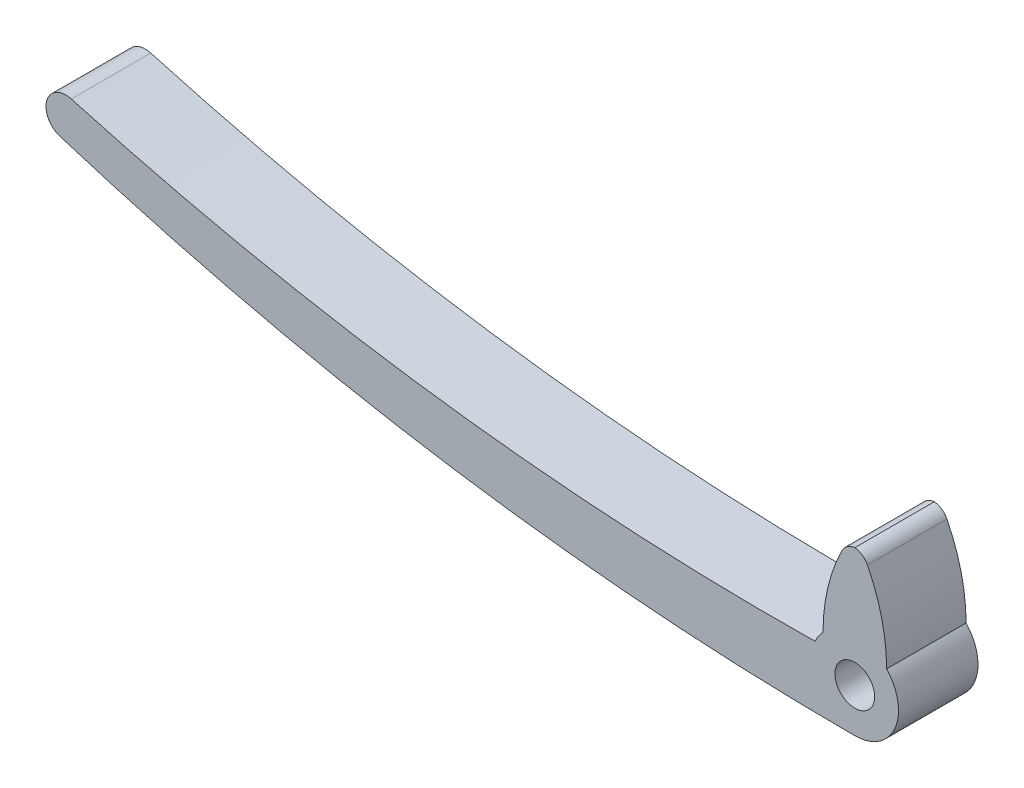
ISO-10303-21;
HEADER;
FILE_DESCRIPTION(('STEP AP214'),'2;1');
FILE_NAME('part.step','',(''),(''),'','','');
FILE_SCHEMA(('AUTOMOTIVE_DESIGN { 1 0 10303 214 1 1 1 1 }'));
ENDSEC;
DATA;
#1=APPLICATION_CONTEXT('core data for automotive mechanical design processes');
#2=APPLICATION_PROTOCOL_DEFINITION('international standard','automotive_design',2000,#1);
#3=PRODUCT_CONTEXT('',#1,'mechanical');
#4=PRODUCT('Part','Part','',(#3));
#5=PRODUCT_RELATED_PRODUCT_CATEGORY('part','',(#4));
#6=PRODUCT_DEFINITION_FORMATION('','',#4);
#7=PRODUCT_DEFINITION_CONTEXT('part definition',#1,'design');
#8=PRODUCT_DEFINITION('design','',#6,#7);
#9=PRODUCT_DEFINITION_SHAPE('','',#8);
#10=(LENGTH_UNIT() NAMED_UNIT(*) SI_UNIT(.MILLI.,.METRE.));
#11=(NAMED_UNIT(*) PLANE_ANGLE_UNIT() SI_UNIT($,.RADIAN.));
#12=(NAMED_UNIT(*) SI_UNIT($,.STERADIAN.) SOLID_ANGLE_UNIT());
#13=UNCERTAINTY_MEASURE_WITH_UNIT(LENGTH_MEASURE(1.E-05),#10,'distance_accuracy_value','');
#14=(GEOMETRIC_REPRESENTATION_CONTEXT(3) GLOBAL_UNCERTAINTY_ASSIGNED_CONTEXT((#13)) GLOBAL_UNIT_ASSIGNED_CONTEXT((#10,
#11,#12)) REPRESENTATION_CONTEXT('',''));
#15=CARTESIAN_POINT('',(0.,0.,0.));
#16=DIRECTION('',(0.,0.,1.));
#17=DIRECTION('',(1.,0.,0.));
#18=AXIS2_PLACEMENT_3D('',#15,#16,#17);
#19=CARTESIAN_POINT('',(-99.2546151641321,12.1869343405152,5.));
#20=DIRECTION('',(0.,0.,1.));
#21=DIRECTION('',(1.,0.,0.));
#22=AXIS2_PLACEMENT_3D('',#19,#20,#21);
#23=PLANE('',#22);
#24=CARTESIAN_POINT('',(-18.5004139118231,3.77491721763537,5.));
#25=DIRECTION('',(0.,0.,1.));
#26=DIRECTION('',(1.,0.,0.));
#27=AXIS2_PLACEMENT_3D('',#24,#25,#26);
#28=CIRCLE('',#27,22.5004139118231);
#29=CARTESIAN_POINT('',(4.,3.77491721763538,5.));
#30=VERTEX_POINT('',#29);
#31=CARTESIAN_POINT('',(1.59315543966662,13.8999899047935,5.));
#32=VERTEX_POINT('',#31);
#33=EDGE_CURVE('E159',#30,#32,#28,.T.);
#34=ORIENTED_EDGE('',*,*,#33,.T.);
#35=CARTESIAN_POINT('',(-0.192906757254242,13.,5.));
#36=DIRECTION('',(0.,0.,1.));
#37=DIRECTION('',(1.,0.,0.));
#38=AXIS2_PLACEMENT_3D('',#35,#36,#37);
#39=CIRCLE('',#38,2.);
#40=CARTESIAN_POINT('',(0.,14.9906750068772,5.));
#41=VERTEX_POINT('',#40);
#42=EDGE_CURVE('E48',#32,#41,#39,.T.);
#43=ORIENTED_EDGE('',*,*,#42,.T.);
#44=CARTESIAN_POINT('',(0.192906757254242,13.,5.));
#45=DIRECTION('',(0.,0.,1.));
#46=DIRECTION('',(1.,0.,0.));
#47=AXIS2_PLACEMENT_3D('',#44,#45,#46);
#48=CIRCLE('',#47,2.);
#49=CARTESIAN_POINT('',(-1.59315543966662,13.8999899047935,5.));
#50=VERTEX_POINT('',#49);
#51=EDGE_CURVE('E58',#41,#50,#48,.T.);
#52=ORIENTED_EDGE('',*,*,#51,.T.);
#53=CARTESIAN_POINT('',(18.5004139118231,3.77491721763537,5.));
#54=DIRECTION('',(0.,0.,1.));
#55=DIRECTION('',(1.,0.,0.));
#56=AXIS2_PLACEMENT_3D('',#53,#54,#55);
#57=CIRCLE('',#56,22.5004139118231);
#58=CARTESIAN_POINT('',(-4.,3.77491721763538,5.));
#59=VERTEX_POINT('',#58);
#60=EDGE_CURVE('E166',#50,#59,#57,.T.);
#61=ORIENTED_EDGE('',*,*,#60,.T.);
#62=CARTESIAN_POINT('',(0.,0.,5.));
#63=DIRECTION('',(0.,0.,1.));
#64=DIRECTION('',(1.,0.,0.));
#65=AXIS2_PLACEMENT_3D('',#62,#63,#64);
#66=CIRCLE('',#65,5.50000000000001);
#67=CARTESIAN_POINT('',(-5.00000000000002,2.29128784747789,5.));
#68=VERTEX_POINT('',#67);
#69=EDGE_CURVE('E170',#59,#68,#66,.T.);
#70=ORIENTED_EDGE('',*,*,#69,.T.);
#71=CARTESIAN_POINT('',(-9.87513473416539,327.254721269338,5.));
#72=DIRECTION('',(0.,0.,-1.));
#73=DIRECTION('',(1.,0.,0.));
#74=AXIS2_PLACEMENT_3D('',#71,#72,#73);
#75=CIRCLE('',#74,325.);
#76=CARTESIAN_POINT('',(-98.5722662534116,14.592253326258,5.));
#77=VERTEX_POINT('',#76);
#78=EDGE_CURVE('E123',#68,#77,#75,.T.);
#79=ORIENTED_EDGE('',*,*,#78,.T.);
#80=CARTESIAN_POINT('',(-99.2546151641321,12.1869343405152,5.));
#81=DIRECTION('',(0.,0.,1.));
#82=DIRECTION('',(1.,0.,0.));
#83=AXIS2_PLACEMENT_3D('',#80,#81,#82);
#84=CIRCLE('',#83,2.50023188107351);
#85=CARTESIAN_POINT('',(-100.002221288429,9.80109181804001,5.));
#86=VERTEX_POINT('',#85);
#87=EDGE_CURVE('E118',#77,#86,#84,.T.);
#88=ORIENTED_EDGE('',*,*,#87,.T.);
#89=CARTESIAN_POINT('',(0.,328.939130068396,5.));
#90=DIRECTION('',(0.,0.,1.));
#91=DIRECTION('',(1.,0.,0.));
#92=AXIS2_PLACEMENT_3D('',#89,#90,#91);
#93=CIRCLE('',#92,334.439130068396);
#94=CARTESIAN_POINT('',(0.,-5.50000000000001,5.));
#95=VERTEX_POINT('',#94);
#96=EDGE_CURVE('E107',#86,#95,#93,.T.);
#97=ORIENTED_EDGE('',*,*,#96,.T.);
#98=CARTESIAN_POINT('',(0.,0.,5.));
#99=DIRECTION('',(0.,0.,1.));
#100=DIRECTION('',(1.,0.,0.));
#101=AXIS2_PLACEMENT_3D('',#98,#99,#100);
#102=CIRCLE('',#101,5.5);
#103=EDGE_CURVE('E117',#95,#30,#102,.T.);
#104=ORIENTED_EDGE('',*,*,#103,.T.);
#105=EDGE_LOOP('',(#34,#43,#52,#61,#70,#79,#88,#97,#104));
#106=FACE_BOUND('',#105,.T.);
#107=CARTESIAN_POINT('',(0.,0.,5.));
#108=DIRECTION('',(0.,0.,1.));
#109=DIRECTION('',(1.,0.,0.));
#110=AXIS2_PLACEMENT_3D('',#107,#108,#109);
#111=CIRCLE('',#110,2.5);
#112=CARTESIAN_POINT('',(2.5,0.,5.));
#113=VERTEX_POINT('',#112);
#114=EDGE_CURVE('E182',#113,#113,#111,.T.);
#115=ORIENTED_EDGE('',*,*,#114,.F.);
#116=EDGE_LOOP('',(#115));
#117=FACE_BOUND('',#116,.T.);
#118=ADVANCED_FACE('F38',(#106,#117),#23,.T.);
#119=CARTESIAN_POINT('',(-99.2546151641321,12.1869343405152,-5.));
#120=DIRECTION('',(0.,0.,1.));
#121=DIRECTION('',(1.,0.,0.));
#122=AXIS2_PLACEMENT_3D('',#119,#120,#121);
#123=PLANE('',#122);
#124=CARTESIAN_POINT('',(0.192906757254242,13.,-5.));
#125=DIRECTION('',(0.,0.,1.));
#126=DIRECTION('',(1.,0.,0.));
#127=AXIS2_PLACEMENT_3D('',#124,#125,#126);
#128=CIRCLE('',#127,2.);
#129=CARTESIAN_POINT('',(-1.59315543966662,13.8999899047935,-5.));
#130=VERTEX_POINT('',#129);
#131=CARTESIAN_POINT('',(0.,14.9906750068772,-5.));
#132=VERTEX_POINT('',#131);
#133=EDGE_CURVE('E134',#130,#132,#128,.F.);
#134=ORIENTED_EDGE('',*,*,#133,.T.);
#135=CARTESIAN_POINT('',(-0.192906757254242,13.,-5.));
#136=DIRECTION('',(0.,0.,1.));
#137=DIRECTION('',(1.,0.,0.));
#138=AXIS2_PLACEMENT_3D('',#135,#136,#137);
#139=CIRCLE('',#138,2.);
#140=CARTESIAN_POINT('',(1.59315543966662,13.8999899047935,-5.));
#141=VERTEX_POINT('',#140);
#142=EDGE_CURVE('E138',#132,#141,#139,.F.);
#143=ORIENTED_EDGE('',*,*,#142,.T.);
#144=CARTESIAN_POINT('',(-18.5004139118231,3.77491721763537,-5.));
#145=DIRECTION('',(0.,0.,1.));
#146=DIRECTION('',(1.,0.,0.));
#147=AXIS2_PLACEMENT_3D('',#144,#145,#146);
#148=CIRCLE('',#147,22.5004139118231);
#149=CARTESIAN_POINT('',(4.,3.77491721763538,-5.));
#150=VERTEX_POINT('',#149);
#151=EDGE_CURVE('E161',#150,#141,#148,.T.);
#152=ORIENTED_EDGE('',*,*,#151,.F.);
#153=CARTESIAN_POINT('',(0.,0.,-5.));
#154=DIRECTION('',(0.,0.,1.));
#155=DIRECTION('',(1.,0.,0.));
#156=AXIS2_PLACEMENT_3D('',#153,#154,#155);
#157=CIRCLE('',#156,5.5);
#158=CARTESIAN_POINT('',(0.,-5.50000000000001,-5.));
#159=VERTEX_POINT('',#158);
#160=EDGE_CURVE('E185',#159,#150,#157,.T.);
#161=ORIENTED_EDGE('',*,*,#160,.F.);
#162=CARTESIAN_POINT('',(0.,328.939130068396,-5.));
#163=DIRECTION('',(0.,0.,1.));
#164=DIRECTION('',(1.,0.,0.));
#165=AXIS2_PLACEMENT_3D('',#162,#163,#164);
#166=CIRCLE('',#165,334.439130068396);
#167=CARTESIAN_POINT('',(-100.002221288429,9.80109181804001,-5.));
#168=VERTEX_POINT('',#167);
#169=EDGE_CURVE('E181',#168,#159,#166,.T.);
#170=ORIENTED_EDGE('',*,*,#169,.F.);
#171=CARTESIAN_POINT('',(-99.2546151641321,12.1869343405152,-5.));
#172=DIRECTION('',(0.,0.,1.));
#173=DIRECTION('',(1.,0.,0.));
#174=AXIS2_PLACEMENT_3D('',#171,#172,#173);
#175=CIRCLE('',#174,2.50023188107351);
#176=CARTESIAN_POINT('',(-98.5722662534116,14.592253326258,-5.));
#177=VERTEX_POINT('',#176);
#178=EDGE_CURVE('E132',#177,#168,#175,.T.);
#179=ORIENTED_EDGE('',*,*,#178,.F.);
#180=CARTESIAN_POINT('',(-9.87513473416539,327.254721269338,-5.));
#181=DIRECTION('',(0.,0.,-1.));
#182=DIRECTION('',(1.,0.,0.));
#183=AXIS2_PLACEMENT_3D('',#180,#181,#182);
#184=CIRCLE('',#183,325.);
#185=CARTESIAN_POINT('',(-5.00000000000002,2.29128784747789,-5.));
#186=VERTEX_POINT('',#185);
#187=EDGE_CURVE('E128',#186,#177,#184,.T.);
#188=ORIENTED_EDGE('',*,*,#187,.F.);
#189=CARTESIAN_POINT('',(0.,0.,-5.));
#190=DIRECTION('',(0.,0.,1.));
#191=DIRECTION('',(1.,0.,0.));
#192=AXIS2_PLACEMENT_3D('',#189,#190,#191);
#193=CIRCLE('',#192,5.50000000000001);
#194=CARTESIAN_POINT('',(-4.,3.77491721763538,-5.));
#195=VERTEX_POINT('',#194);
#196=EDGE_CURVE('E193',#195,#186,#193,.T.);
#197=ORIENTED_EDGE('',*,*,#196,.F.);
#198=CARTESIAN_POINT('',(18.5004139118231,3.77491721763537,-5.));
#199=DIRECTION('',(0.,0.,1.));
#200=DIRECTION('',(1.,0.,0.));
#201=AXIS2_PLACEMENT_3D('',#198,#199,#200);
#202=CIRCLE('',#201,22.5004139118231);
#203=EDGE_CURVE('E190',#130,#195,#202,.T.);
#204=ORIENTED_EDGE('',*,*,#203,.F.);
#205=EDGE_LOOP('',(#134,#143,#152,#161,#170,#179,#188,#197,#204));
#206=FACE_BOUND('',#205,.T.);
#207=CARTESIAN_POINT('',(0.,0.,-5.));
#208=DIRECTION('',(0.,0.,1.));
#209=DIRECTION('',(1.,0.,0.));
#210=AXIS2_PLACEMENT_3D('',#207,#208,#209);
#211=CIRCLE('',#210,2.5);
#212=CARTESIAN_POINT('',(2.5,0.,-5.));
#213=VERTEX_POINT('',#212);
#214=EDGE_CURVE('E220',#213,#213,#211,.T.);
#215=ORIENTED_EDGE('',*,*,#214,.T.);
#216=EDGE_LOOP('',(#215));
#217=FACE_BOUND('',#216,.T.);
#218=ADVANCED_FACE('F211',(#206,#217),#123,.F.);
#219=CARTESIAN_POINT('',(-99.2546151641321,12.1869343405152,5.));
#220=DIRECTION('',(0.,0.,-1.));
#221=DIRECTION('',(-1.,0.,0.));
#222=AXIS2_PLACEMENT_3D('',#219,#220,#221);
#223=CYLINDRICAL_SURFACE('',#222,2.50023188107351);
#224=ORIENTED_EDGE('',*,*,#178,.T.);
#225=DIRECTION('',(0.,0.,-1.));
#226=VECTOR('',#225,1.);
#227=CARTESIAN_POINT('',(-100.002221288429,9.80109181804001,5.));
#228=LINE('',#227,#226);
#229=EDGE_CURVE('E111',#86,#168,#228,.T.);
#230=ORIENTED_EDGE('',*,*,#229,.F.);
#231=ORIENTED_EDGE('',*,*,#87,.F.);
#232=DIRECTION('',(0.,0.,-1.));
#233=VECTOR('',#232,1.);
#234=CARTESIAN_POINT('',(-98.5722662534116,14.592253326258,5.));
#235=LINE('',#234,#233);
#236=EDGE_CURVE('E178',#77,#177,#235,.T.);
#237=ORIENTED_EDGE('',*,*,#236,.T.);
#238=EDGE_LOOP('',(#224,#230,#231,#237));
#239=FACE_BOUND('',#238,.T.);
#240=ADVANCED_FACE('F130',(#239),#223,.T.);
#241=CARTESIAN_POINT('',(0.,328.939130068396,5.));
#242=DIRECTION('',(0.,0.,-1.));
#243=DIRECTION('',(-1.,0.,0.));
#244=AXIS2_PLACEMENT_3D('',#241,#242,#243);
#245=CYLINDRICAL_SURFACE('',#244,334.439130068396);
#246=ORIENTED_EDGE('',*,*,#169,.T.);
#247=DIRECTION('',(0.,0.,-1.));
#248=VECTOR('',#247,1.);
#249=CARTESIAN_POINT('',(0.,-5.50000000000001,5.));
#250=LINE('',#249,#248);
#251=EDGE_CURVE('E114',#95,#159,#250,.T.);
#252=ORIENTED_EDGE('',*,*,#251,.F.);
#253=ORIENTED_EDGE('',*,*,#96,.F.);
#254=ORIENTED_EDGE('',*,*,#229,.T.);
#255=EDGE_LOOP('',(#246,#252,#253,#254));
#256=FACE_BOUND('',#255,.T.);
#257=ADVANCED_FACE('F109',(#256),#245,.T.);
#258=CARTESIAN_POINT('',(0.,0.,5.));
#259=DIRECTION('',(0.,0.,-1.));
#260=DIRECTION('',(-1.,0.,0.));
#261=AXIS2_PLACEMENT_3D('',#258,#259,#260);
#262=CYLINDRICAL_SURFACE('',#261,5.5);
#263=ORIENTED_EDGE('',*,*,#160,.T.);
#264=DIRECTION('',(0.,0.,-1.));
#265=VECTOR('',#264,1.);
#266=CARTESIAN_POINT('',(4.,3.77491721763538,5.));
#267=LINE('',#266,#265);
#268=EDGE_CURVE('E140',#30,#150,#267,.T.);
#269=ORIENTED_EDGE('',*,*,#268,.F.);
#270=ORIENTED_EDGE('',*,*,#103,.F.);
#271=ORIENTED_EDGE('',*,*,#251,.T.);
#272=EDGE_LOOP('',(#263,#269,#270,#271));
#273=FACE_BOUND('',#272,.T.);
#274=ADVANCED_FACE('F255',(#273),#262,.T.);
#275=CARTESIAN_POINT('',(-18.5004139118231,3.77491721763537,5.));
#276=DIRECTION('',(0.,0.,-1.));
#277=DIRECTION('',(-1.,0.,0.));
#278=AXIS2_PLACEMENT_3D('',#275,#276,#277);
#279=CYLINDRICAL_SURFACE('',#278,22.5004139118231);
#280=ORIENTED_EDGE('',*,*,#151,.T.);
#281=DIRECTION('',(0.,0.,-1.));
#282=VECTOR('',#281,1.);
#283=CARTESIAN_POINT('',(1.59315543966662,13.8999899047935,5.));
#284=LINE('',#283,#282);
#285=EDGE_CURVE('E146',#141,#32,#284,.F.);
#286=ORIENTED_EDGE('',*,*,#285,.T.);
#287=ORIENTED_EDGE('',*,*,#33,.F.);
#288=ORIENTED_EDGE('',*,*,#268,.T.);
#289=EDGE_LOOP('',(#280,#286,#287,#288));
#290=FACE_BOUND('',#289,.T.);
#291=ADVANCED_FACE('F157',(#290),#279,.T.);
#292=CARTESIAN_POINT('',(18.5004139118231,3.77491721763537,5.));
#293=DIRECTION('',(0.,0.,-1.));
#294=DIRECTION('',(-1.,0.,0.));
#295=AXIS2_PLACEMENT_3D('',#292,#293,#294);
#296=CYLINDRICAL_SURFACE('',#295,22.5004139118231);
#297=ORIENTED_EDGE('',*,*,#60,.F.);
#298=DIRECTION('',(0.,0.,-1.));
#299=VECTOR('',#298,1.);
#300=CARTESIAN_POINT('',(-1.59315543966662,13.8999899047935,5.));
#301=LINE('',#300,#299);
#302=EDGE_CURVE('E11',#50,#130,#301,.T.);
#303=ORIENTED_EDGE('',*,*,#302,.T.);
#304=ORIENTED_EDGE('',*,*,#203,.T.);
#305=DIRECTION('',(0.,0.,-1.));
#306=VECTOR('',#305,1.);
#307=CARTESIAN_POINT('',(-4.,3.77491721763538,5.));
#308=LINE('',#307,#306);
#309=EDGE_CURVE('E204',#59,#195,#308,.T.);
#310=ORIENTED_EDGE('',*,*,#309,.F.);
#311=EDGE_LOOP('',(#297,#303,#304,#310));
#312=FACE_BOUND('',#311,.T.);
#313=ADVANCED_FACE('F248',(#312),#296,.T.);
#314=CARTESIAN_POINT('',(0.,0.,5.));
#315=DIRECTION('',(0.,0.,-1.));
#316=DIRECTION('',(-1.,0.,0.));
#317=AXIS2_PLACEMENT_3D('',#314,#315,#316);
#318=CYLINDRICAL_SURFACE('',#317,5.50000000000001);
#319=ORIENTED_EDGE('',*,*,#196,.T.);
#320=DIRECTION('',(0.,0.,-1.));
#321=VECTOR('',#320,1.);
#322=CARTESIAN_POINT('',(-5.00000000000002,2.29128784747789,5.));
#323=LINE('',#322,#321);
#324=EDGE_CURVE('E200',#68,#186,#323,.T.);
#325=ORIENTED_EDGE('',*,*,#324,.F.);
#326=ORIENTED_EDGE('',*,*,#69,.F.);
#327=ORIENTED_EDGE('',*,*,#309,.T.);
#328=EDGE_LOOP('',(#319,#325,#326,#327));
#329=FACE_BOUND('',#328,.T.);
#330=ADVANCED_FACE('F244',(#329),#318,.T.);
#331=CARTESIAN_POINT('',(-9.87513473416539,327.254721269338,5.));
#332=DIRECTION('',(0.,0.,-1.));
#333=DIRECTION('',(-1.,0.,0.));
#334=AXIS2_PLACEMENT_3D('',#331,#332,#333);
#335=CYLINDRICAL_SURFACE('',#334,325.);
#336=ORIENTED_EDGE('',*,*,#187,.T.);
#337=ORIENTED_EDGE('',*,*,#236,.F.);
#338=ORIENTED_EDGE('',*,*,#78,.F.);
#339=ORIENTED_EDGE('',*,*,#324,.T.);
#340=EDGE_LOOP('',(#336,#337,#338,#339));
#341=FACE_BOUND('',#340,.T.);
#342=ADVANCED_FACE('F241',(#341),#335,.F.);
#343=CARTESIAN_POINT('',(0.,0.,5.));
#344=DIRECTION('',(0.,0.,-1.));
#345=DIRECTION('',(-1.,0.,0.));
#346=AXIS2_PLACEMENT_3D('',#343,#344,#345);
#347=CYLINDRICAL_SURFACE('',#346,2.5);
#348=ORIENTED_EDGE('',*,*,#114,.T.);
#349=EDGE_LOOP('',(#348));
#350=FACE_BOUND('',#349,.T.);
#351=ORIENTED_EDGE('',*,*,#214,.F.);
#352=EDGE_LOOP('',(#351));
#353=FACE_BOUND('',#352,.T.);
#354=ADVANCED_FACE('F230',(#350,#353),#347,.F.);
#355=CARTESIAN_POINT('',(0.192906757254242,13.,5.));
#356=DIRECTION('',(0.,0.,-1.));
#357=DIRECTION('',(-1.,0.,0.));
#358=AXIS2_PLACEMENT_3D('',#355,#356,#357);
#359=CYLINDRICAL_SURFACE('',#358,2.);
#360=ORIENTED_EDGE('',*,*,#302,.F.);
#361=ORIENTED_EDGE('',*,*,#51,.F.);
#362=DIRECTION('',(0.,0.,-1.));
#363=VECTOR('',#362,1.);
#364=CARTESIAN_POINT('',(0.,14.9906750068772,0.));
#365=LINE('',#364,#363);
#366=EDGE_CURVE('E42',#132,#41,#365,.F.);
#367=ORIENTED_EDGE('',*,*,#366,.F.);
#368=ORIENTED_EDGE('',*,*,#133,.F.);
#369=EDGE_LOOP('',(#360,#361,#367,#368));
#370=FACE_BOUND('',#369,.T.);
#371=ADVANCED_FACE('F40',(#370),#359,.T.);
#372=CARTESIAN_POINT('',(-0.192906757254242,13.,5.));
#373=DIRECTION('',(0.,0.,-1.));
#374=DIRECTION('',(-1.,0.,0.));
#375=AXIS2_PLACEMENT_3D('',#372,#373,#374);
#376=CYLINDRICAL_SURFACE('',#375,2.);
#377=ORIENTED_EDGE('',*,*,#42,.F.);
#378=ORIENTED_EDGE('',*,*,#285,.F.);
#379=ORIENTED_EDGE('',*,*,#142,.F.);
#380=ORIENTED_EDGE('',*,*,#366,.T.);
#381=EDGE_LOOP('',(#377,#378,#379,#380));
#382=FACE_BOUND('',#381,.T.);
#383=ADVANCED_FACE('F217',(#382),#376,.T.);
#384=CLOSED_SHELL('',(#118,#218,#240,#257,#274,#291,#313,#330,#342,#354,#371,#383));
#385=MANIFOLD_SOLID_BREP('B2',#384);
#386=ADVANCED_BREP_SHAPE_REPRESENTATION('',(#18,#385),#14);
#387=SHAPE_DEFINITION_REPRESENTATION(#9,#386);
ENDSEC;
END-ISO-10303-21;
